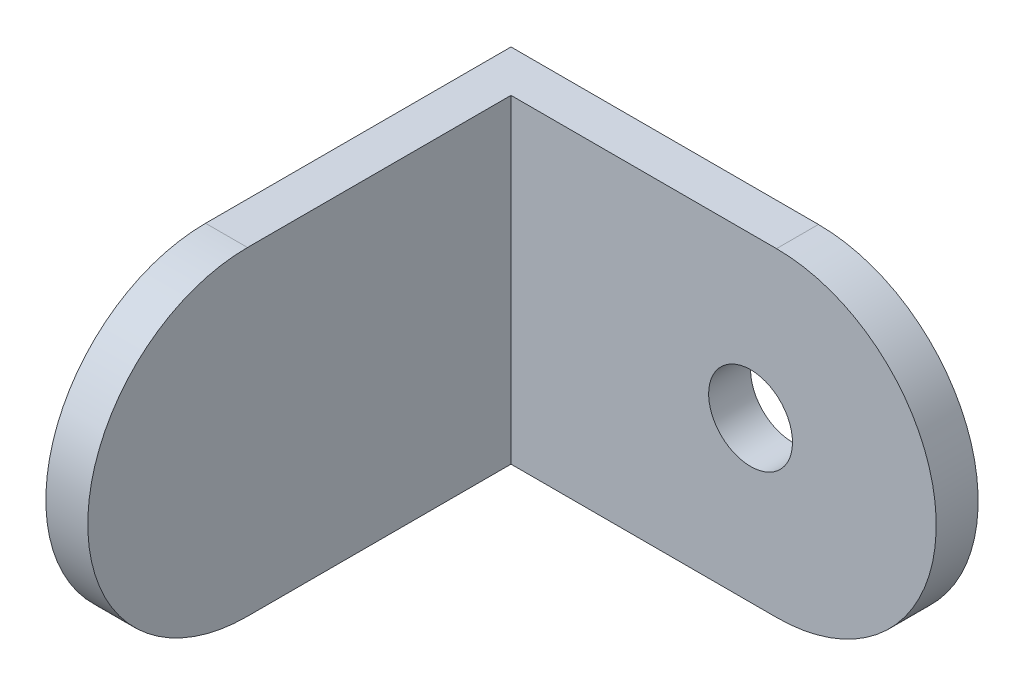
ISO-10303-21;
HEADER;
FILE_DESCRIPTION(('STEP AP214'),'2;1');
FILE_NAME('part.step','',(''),(''),'','','');
FILE_SCHEMA(('AUTOMOTIVE_DESIGN { 1 0 10303 214 1 1 1 1 }'));
ENDSEC;
DATA;
#1=APPLICATION_CONTEXT('core data for automotive mechanical design processes');
#2=APPLICATION_PROTOCOL_DEFINITION('international standard','automotive_design',2000,#1);
#3=PRODUCT_CONTEXT('',#1,'mechanical');
#4=PRODUCT('Part','Part','',(#3));
#5=PRODUCT_RELATED_PRODUCT_CATEGORY('part','',(#4));
#6=PRODUCT_DEFINITION_FORMATION('','',#4);
#7=PRODUCT_DEFINITION_CONTEXT('part definition',#1,'design');
#8=PRODUCT_DEFINITION('design','',#6,#7);
#9=PRODUCT_DEFINITION_SHAPE('','',#8);
#10=(LENGTH_UNIT() NAMED_UNIT(*) SI_UNIT(.MILLI.,.METRE.));
#11=(NAMED_UNIT(*) PLANE_ANGLE_UNIT() SI_UNIT($,.RADIAN.));
#12=(NAMED_UNIT(*) SI_UNIT($,.STERADIAN.) SOLID_ANGLE_UNIT());
#13=UNCERTAINTY_MEASURE_WITH_UNIT(LENGTH_MEASURE(1.E-05),#10,'distance_accuracy_value','');
#14=(GEOMETRIC_REPRESENTATION_CONTEXT(3) GLOBAL_UNCERTAINTY_ASSIGNED_CONTEXT((#13)) GLOBAL_UNIT_ASSIGNED_CONTEXT((#10,
#11,#12)) REPRESENTATION_CONTEXT('',''));
#15=CARTESIAN_POINT('',(0.,0.,0.));
#16=DIRECTION('',(0.,0.,1.));
#17=DIRECTION('',(1.,0.,0.));
#18=AXIS2_PLACEMENT_3D('',#15,#16,#17);
#19=CARTESIAN_POINT('',(2.10000000000001,-1.17961196366423E-13,15.3));
#20=DIRECTION('',(1.,0.,0.));
#21=DIRECTION('',(0.,1.,0.));
#22=AXIS2_PLACEMENT_3D('',#19,#20,#21);
#23=PLANE('',#22);
#24=CARTESIAN_POINT('',(2.10000000000001,7.99999999999988,15.3));
#25=DIRECTION('',(-1.,0.,0.));
#26=DIRECTION('',(0.,-1.,0.));
#27=AXIS2_PLACEMENT_3D('',#24,#25,#26);
#28=CIRCLE('',#27,8.);
#29=CARTESIAN_POINT('',(2.1,-1.17961196366423E-13,15.3));
#30=VERTEX_POINT('',#29);
#31=CARTESIAN_POINT('',(2.09999999999977,15.9999999999999,15.3));
#32=VERTEX_POINT('',#31);
#33=EDGE_CURVE('E48',#30,#32,#28,.T.);
#34=ORIENTED_EDGE('',*,*,#33,.F.);
#35=DIRECTION('',(0.,0.,1.));
#36=VECTOR('',#35,1.);
#37=CARTESIAN_POINT('',(2.09999999999955,0.,2.0999999999999));
#38=LINE('',#37,#36);
#39=CARTESIAN_POINT('',(2.09999999999955,-1.19695919842399E-13,2.0999999999999));
#40=VERTEX_POINT('',#39);
#41=EDGE_CURVE('E122',#40,#30,#38,.T.);
#42=ORIENTED_EDGE('',*,*,#41,.F.);
#43=DIRECTION('',(0.,-1.,0.));
#44=VECTOR('',#43,1.);
#45=CARTESIAN_POINT('',(2.09999999999955,0.,2.0999999999999));
#46=LINE('',#45,#44);
#47=CARTESIAN_POINT('',(2.09999999999955,16.,2.10000000000001));
#48=VERTEX_POINT('',#47);
#49=EDGE_CURVE('E119',#48,#40,#46,.T.);
#50=ORIENTED_EDGE('',*,*,#49,.F.);
#51=DIRECTION('',(0.,0.,1.));
#52=VECTOR('',#51,1.);
#53=CARTESIAN_POINT('',(2.09999999999955,16.,2.10000000000001));
#54=LINE('',#53,#52);
#55=EDGE_CURVE('E126',#48,#32,#54,.T.);
#56=ORIENTED_EDGE('',*,*,#55,.T.);
#57=EDGE_LOOP('',(#34,#42,#50,#56));
#58=FACE_BOUND('',#57,.T.);
#59=ADVANCED_FACE('F39',(#58),#23,.T.);
#60=CARTESIAN_POINT('',(0.,7.99999999999988,15.3));
#61=DIRECTION('',(-1.,0.,0.));
#62=DIRECTION('',(0.,-1.,0.));
#63=AXIS2_PLACEMENT_3D('',#60,#61,#62);
#64=PLANE('',#63);
#65=CARTESIAN_POINT('',(0.,7.99999999999988,15.3));
#66=DIRECTION('',(-1.,0.,0.));
#67=DIRECTION('',(0.,-1.,0.));
#68=AXIS2_PLACEMENT_3D('',#65,#66,#67);
#69=CIRCLE('',#68,8.);
#70=CARTESIAN_POINT('',(0.,-1.14491749414469E-13,15.3));
#71=VERTEX_POINT('',#70);
#72=CARTESIAN_POINT('',(0.,15.9999999999999,15.3));
#73=VERTEX_POINT('',#72);
#74=EDGE_CURVE('E11',#71,#73,#69,.T.);
#75=ORIENTED_EDGE('',*,*,#74,.T.);
#76=DIRECTION('',(0.,0.,1.));
#77=VECTOR('',#76,1.);
#78=CARTESIAN_POINT('',(-4.43097939292364E-13,16.,2.10000000000005));
#79=LINE('',#78,#77);
#80=CARTESIAN_POINT('',(0.,15.9999999999999,0.));
#81=VERTEX_POINT('',#80);
#82=EDGE_CURVE('E128',#81,#73,#79,.T.);
#83=ORIENTED_EDGE('',*,*,#82,.F.);
#84=DIRECTION('',(0.,1.,0.));
#85=VECTOR('',#84,1.);
#86=CARTESIAN_POINT('',(0.,15.9999999999999,0.));
#87=LINE('',#86,#85);
#88=CARTESIAN_POINT('',(0.,-1.05124242644194E-13,0.));
#89=VERTEX_POINT('',#88);
#90=EDGE_CURVE('E105',#89,#81,#87,.T.);
#91=ORIENTED_EDGE('',*,*,#90,.F.);
#92=DIRECTION('',(0.,0.,1.));
#93=VECTOR('',#92,1.);
#94=CARTESIAN_POINT('',(-4.43097939292366E-13,0.,2.09999999999994));
#95=LINE('',#94,#93);
#96=EDGE_CURVE('E98',#89,#71,#95,.T.);
#97=ORIENTED_EDGE('',*,*,#96,.T.);
#98=EDGE_LOOP('',(#75,#83,#91,#97));
#99=FACE_BOUND('',#98,.T.);
#100=ADVANCED_FACE('F41',(#99),#64,.T.);
#101=CARTESIAN_POINT('',(2.10000000000002,7.99999999999988,15.3));
#102=DIRECTION('',(-1.,0.,0.));
#103=DIRECTION('',(0.,-1.,0.));
#104=AXIS2_PLACEMENT_3D('',#101,#102,#103);
#105=CYLINDRICAL_SURFACE('',#104,8.);
#106=DIRECTION('',(1.,0.,0.));
#107=VECTOR('',#106,1.);
#108=CARTESIAN_POINT('',(0.,-1.14491749414469E-13,15.3));
#109=LINE('',#108,#107);
#110=EDGE_CURVE('E140',#71,#30,#109,.T.);
#111=ORIENTED_EDGE('',*,*,#110,.T.);
#112=ORIENTED_EDGE('',*,*,#33,.T.);
#113=DIRECTION('',(1.,0.,0.));
#114=VECTOR('',#113,1.);
#115=CARTESIAN_POINT('',(0.,15.9999999999999,15.3));
#116=LINE('',#115,#114);
#117=EDGE_CURVE('E135',#73,#32,#116,.T.);
#118=ORIENTED_EDGE('',*,*,#117,.F.);
#119=ORIENTED_EDGE('',*,*,#74,.F.);
#120=EDGE_LOOP('',(#111,#112,#118,#119));
#121=FACE_BOUND('',#120,.T.);
#122=ADVANCED_FACE('F139',(#121),#105,.T.);
#123=CARTESIAN_POINT('',(-4.43097939292366E-13,0.,2.09999999999994));
#124=DIRECTION('',(0.,1.,0.));
#125=DIRECTION('',(0.,0.,1.));
#126=AXIS2_PLACEMENT_3D('',#123,#124,#125);
#127=PLANE('',#126);
#128=ORIENTED_EDGE('',*,*,#110,.F.);
#129=ORIENTED_EDGE('',*,*,#96,.F.);
#130=DIRECTION('',(-1.,0.,0.));
#131=VECTOR('',#130,1.);
#132=CARTESIAN_POINT('',(0.,-1.05124242644194E-13,0.));
#133=LINE('',#132,#131);
#134=CARTESIAN_POINT('',(15.4,-1.05124242644192E-13,-3.10081821330854E-13));
#135=VERTEX_POINT('',#134);
#136=EDGE_CURVE('E89',#135,#89,#133,.T.);
#137=ORIENTED_EDGE('',*,*,#136,.F.);
#138=DIRECTION('',(0.,0.,1.));
#139=VECTOR('',#138,1.);
#140=CARTESIAN_POINT('',(15.4,-1.05124242644192E-13,-3.10081821330854E-13));
#141=LINE('',#140,#139);
#142=CARTESIAN_POINT('',(15.4,-1.19695919842398E-13,2.09999999999968));
#143=VERTEX_POINT('',#142);
#144=EDGE_CURVE('E96',#135,#143,#141,.T.);
#145=ORIENTED_EDGE('',*,*,#144,.T.);
#146=DIRECTION('',(-1.,0.,0.));
#147=VECTOR('',#146,1.);
#148=CARTESIAN_POINT('',(0.,-1.19695919842399E-13,2.09999999999994));
#149=LINE('',#148,#147);
#150=EDGE_CURVE('E148',#143,#40,#149,.T.);
#151=ORIENTED_EDGE('',*,*,#150,.T.);
#152=ORIENTED_EDGE('',*,*,#41,.T.);
#153=EDGE_LOOP('',(#128,#129,#137,#145,#151,#152));
#154=FACE_BOUND('',#153,.T.);
#155=ADVANCED_FACE('F91',(#154),#127,.F.);
#156=CARTESIAN_POINT('',(2.09999999999955,16.,2.10000000000001));
#157=DIRECTION('',(0.,-1.,0.));
#158=DIRECTION('',(0.,0.,-1.));
#159=AXIS2_PLACEMENT_3D('',#156,#157,#158);
#160=PLANE('',#159);
#161=ORIENTED_EDGE('',*,*,#117,.T.);
#162=ORIENTED_EDGE('',*,*,#55,.F.);
#163=DIRECTION('',(1.,0.,0.));
#164=VECTOR('',#163,1.);
#165=CARTESIAN_POINT('',(15.4,15.9999999999999,2.09999999999979));
#166=LINE('',#165,#164);
#167=CARTESIAN_POINT('',(15.4,15.9999999999999,2.09999999999979));
#168=VERTEX_POINT('',#167);
#169=EDGE_CURVE('E115',#48,#168,#166,.T.);
#170=ORIENTED_EDGE('',*,*,#169,.T.);
#171=DIRECTION('',(0.,0.,1.));
#172=VECTOR('',#171,1.);
#173=CARTESIAN_POINT('',(15.4,15.9999999999999,-1.99059518868339E-13));
#174=LINE('',#173,#172);
#175=CARTESIAN_POINT('',(15.4,15.9999999999999,-1.99059518868339E-13));
#176=VERTEX_POINT('',#175);
#177=EDGE_CURVE('E117',#176,#168,#174,.T.);
#178=ORIENTED_EDGE('',*,*,#177,.F.);
#179=DIRECTION('',(1.,0.,0.));
#180=VECTOR('',#179,1.);
#181=CARTESIAN_POINT('',(15.4,15.9999999999999,-1.99059518868339E-13));
#182=LINE('',#181,#180);
#183=EDGE_CURVE('E107',#81,#176,#182,.T.);
#184=ORIENTED_EDGE('',*,*,#183,.F.);
#185=ORIENTED_EDGE('',*,*,#82,.T.);
#186=EDGE_LOOP('',(#161,#162,#170,#178,#184,#185));
#187=FACE_BOUND('',#186,.T.);
#188=ADVANCED_FACE('F143',(#187),#160,.F.);
#189=CARTESIAN_POINT('',(15.4,7.99999999999989,-2.54570670099596E-13));
#190=DIRECTION('',(0.,0.,1.));
#191=DIRECTION('',(1.,0.,0.));
#192=AXIS2_PLACEMENT_3D('',#189,#190,#191);
#193=CYLINDRICAL_SURFACE('',#192,8.);
#194=CARTESIAN_POINT('',(15.4,7.99999999999988,2.09999999999974));
#195=DIRECTION('',(0.,0.,-1.));
#196=DIRECTION('',(1.,0.,0.));
#197=AXIS2_PLACEMENT_3D('',#194,#195,#196);
#198=CIRCLE('',#197,8.);
#199=EDGE_CURVE('E118',#168,#143,#198,.T.);
#200=ORIENTED_EDGE('',*,*,#199,.T.);
#201=ORIENTED_EDGE('',*,*,#144,.F.);
#202=CARTESIAN_POINT('',(15.4,7.99999999999989,-2.54570670099596E-13));
#203=DIRECTION('',(0.,0.,-1.));
#204=DIRECTION('',(1.,0.,0.));
#205=AXIS2_PLACEMENT_3D('',#202,#203,#204);
#206=CIRCLE('',#205,8.);
#207=EDGE_CURVE('E103',#176,#135,#206,.T.);
#208=ORIENTED_EDGE('',*,*,#207,.F.);
#209=ORIENTED_EDGE('',*,*,#177,.T.);
#210=EDGE_LOOP('',(#200,#201,#208,#209));
#211=FACE_BOUND('',#210,.T.);
#212=ADVANCED_FACE('F111',(#211),#193,.T.);
#213=CARTESIAN_POINT('',(15.4,7.99999999999989,-2.54570670099596E-13));
#214=DIRECTION('',(0.,0.,1.));
#215=DIRECTION('',(1.,0.,0.));
#216=AXIS2_PLACEMENT_3D('',#213,#214,#215);
#217=PLANE('',#216);
#218=CARTESIAN_POINT('',(14.1,7.99999999999988,-1.78735555435583E-13));
#219=DIRECTION('',(0.,0.,-1.));
#220=DIRECTION('',(0.,1.,0.));
#221=AXIS2_PLACEMENT_3D('',#218,#219,#220);
#222=CIRCLE('',#221,2.09999999999999);
#223=CARTESIAN_POINT('',(14.1,10.0999999999999,-1.64163878237378E-13));
#224=VERTEX_POINT('',#223);
#225=EDGE_CURVE('E155',#224,#224,#222,.T.);
#226=ORIENTED_EDGE('',*,*,#225,.F.);
#227=EDGE_LOOP('',(#226));
#228=FACE_BOUND('',#227,.T.);
#229=ORIENTED_EDGE('',*,*,#207,.T.);
#230=ORIENTED_EDGE('',*,*,#136,.T.);
#231=ORIENTED_EDGE('',*,*,#90,.T.);
#232=ORIENTED_EDGE('',*,*,#183,.T.);
#233=EDGE_LOOP('',(#229,#230,#231,#232));
#234=FACE_BOUND('',#233,.T.);
#235=ADVANCED_FACE('F106',(#228,#234),#217,.F.);
#236=CARTESIAN_POINT('',(15.4,7.99999999999988,2.09999999999974));
#237=DIRECTION('',(0.,0.,1.));
#238=DIRECTION('',(1.,0.,0.));
#239=AXIS2_PLACEMENT_3D('',#236,#237,#238);
#240=PLANE('',#239);
#241=CARTESIAN_POINT('',(14.1,7.99999999999986,2.09999999999976));
#242=DIRECTION('',(0.,0.,1.));
#243=DIRECTION('',(1.,0.,0.));
#244=AXIS2_PLACEMENT_3D('',#241,#242,#243);
#245=CIRCLE('',#244,2.09999999999999);
#246=CARTESIAN_POINT('',(16.2,7.99999999999986,2.09999999999972));
#247=VERTEX_POINT('',#246);
#248=EDGE_CURVE('E43',#247,#247,#245,.T.);
#249=ORIENTED_EDGE('',*,*,#248,.F.);
#250=EDGE_LOOP('',(#249));
#251=FACE_BOUND('',#250,.T.);
#252=ORIENTED_EDGE('',*,*,#169,.F.);
#253=ORIENTED_EDGE('',*,*,#49,.T.);
#254=ORIENTED_EDGE('',*,*,#150,.F.);
#255=ORIENTED_EDGE('',*,*,#199,.F.);
#256=EDGE_LOOP('',(#252,#253,#254,#255));
#257=FACE_BOUND('',#256,.T.);
#258=ADVANCED_FACE('F144',(#251,#257),#240,.T.);
#259=CARTESIAN_POINT('',(14.1,7.99999999999988,-1.77437429828487E-13));
#260=DIRECTION('',(0.,0.,-1.));
#261=DIRECTION('',(0.,1.,0.));
#262=AXIS2_PLACEMENT_3D('',#259,#260,#261);
#263=CYLINDRICAL_SURFACE('',#262,2.09999999999999);
#264=ORIENTED_EDGE('',*,*,#248,.T.);
#265=EDGE_LOOP('',(#264));
#266=FACE_BOUND('',#265,.T.);
#267=ORIENTED_EDGE('',*,*,#225,.T.);
#268=EDGE_LOOP('',(#267));
#269=FACE_BOUND('',#268,.T.);
#270=ADVANCED_FACE('F157',(#266,#269),#263,.F.);
#271=CLOSED_SHELL('',(#59,#100,#122,#155,#188,#212,#235,#258,#270));
#272=MANIFOLD_SOLID_BREP('B2',#271);
#273=ADVANCED_BREP_SHAPE_REPRESENTATION('',(#18,#272),#14);
#274=SHAPE_DEFINITION_REPRESENTATION(#9,#273);
ENDSEC;
END-ISO-10303-21;
